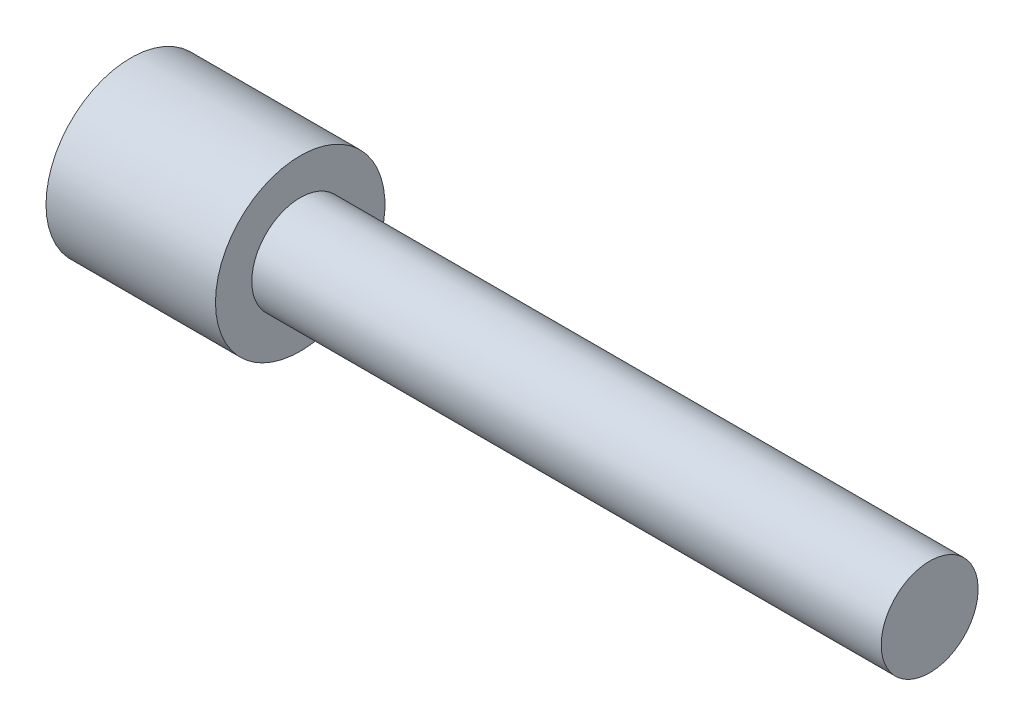
ISO-10303-21;
HEADER;
FILE_DESCRIPTION(('STEP AP214'),'2;1');
FILE_NAME('part.step','',(''),(''),'','','');
FILE_SCHEMA(('AUTOMOTIVE_DESIGN { 1 0 10303 214 1 1 1 1 }'));
ENDSEC;
DATA;
#1=APPLICATION_CONTEXT('core data for automotive mechanical design processes');
#2=APPLICATION_PROTOCOL_DEFINITION('international standard','automotive_design',2000,#1);
#3=PRODUCT_CONTEXT('',#1,'mechanical');
#4=PRODUCT('Part','Part','',(#3));
#5=PRODUCT_RELATED_PRODUCT_CATEGORY('part','',(#4));
#6=PRODUCT_DEFINITION_FORMATION('','',#4);
#7=PRODUCT_DEFINITION_CONTEXT('part definition',#1,'design');
#8=PRODUCT_DEFINITION('design','',#6,#7);
#9=PRODUCT_DEFINITION_SHAPE('','',#8);
#10=(LENGTH_UNIT() NAMED_UNIT(*) SI_UNIT(.MILLI.,.METRE.));
#11=(NAMED_UNIT(*) PLANE_ANGLE_UNIT() SI_UNIT($,.RADIAN.));
#12=(NAMED_UNIT(*) SI_UNIT($,.STERADIAN.) SOLID_ANGLE_UNIT());
#13=UNCERTAINTY_MEASURE_WITH_UNIT(LENGTH_MEASURE(1.E-05),#10,'distance_accuracy_value','');
#14=(GEOMETRIC_REPRESENTATION_CONTEXT(3) GLOBAL_UNCERTAINTY_ASSIGNED_CONTEXT((#13)) GLOBAL_UNIT_ASSIGNED_CONTEXT((#10,
#11,#12)) REPRESENTATION_CONTEXT('',''));
#15=CARTESIAN_POINT('',(0.,0.,0.));
#16=DIRECTION('',(0.,0.,1.));
#17=DIRECTION('',(1.,0.,0.));
#18=AXIS2_PLACEMENT_3D('',#15,#16,#17);
#19=CARTESIAN_POINT('',(-3.30120481927711,1.75,0.));
#20=DIRECTION('',(1.,0.,0.));
#21=DIRECTION('',(0.,0.,-1.));
#22=AXIS2_PLACEMENT_3D('',#19,#20,#21);
#23=PLANE('',#22);
#24=CARTESIAN_POINT('',(-3.30120481927711,0.,0.));
#25=DIRECTION('',(-1.,0.,0.));
#26=DIRECTION('',(0.,0.,1.));
#27=AXIS2_PLACEMENT_3D('',#24,#25,#26);
#28=CIRCLE('',#27,1.75);
#29=CARTESIAN_POINT('',(-3.30120481927711,0.,1.75));
#30=VERTEX_POINT('',#29);
#31=EDGE_CURVE('E47',#30,#30,#28,.T.);
#32=ORIENTED_EDGE('',*,*,#31,.T.);
#33=EDGE_LOOP('',(#32));
#34=FACE_BOUND('',#33,.T.);
#35=ADVANCED_FACE('F33',(#34),#23,.F.);
#36=CARTESIAN_POINT('',(13.1987951807229,0.,0.));
#37=DIRECTION('',(-1.,0.,0.));
#38=DIRECTION('',(0.,0.,1.));
#39=AXIS2_PLACEMENT_3D('',#36,#37,#38);
#40=PLANE('',#39);
#41=CARTESIAN_POINT('',(13.1987951807229,0.,0.));
#42=DIRECTION('',(-1.,0.,0.));
#43=DIRECTION('',(0.,0.,1.));
#44=AXIS2_PLACEMENT_3D('',#41,#42,#43);
#45=CIRCLE('',#44,1.);
#46=CARTESIAN_POINT('',(13.1987951807229,0.,1.));
#47=VERTEX_POINT('',#46);
#48=EDGE_CURVE('E10',#47,#47,#45,.T.);
#49=ORIENTED_EDGE('',*,*,#48,.F.);
#50=EDGE_LOOP('',(#49));
#51=FACE_BOUND('',#50,.T.);
#52=ADVANCED_FACE('F67',(#51),#40,.F.);
#53=CARTESIAN_POINT('',(-3.30120481927711,0.,0.));
#54=DIRECTION('',(-1.,0.,0.));
#55=DIRECTION('',(0.,0.,1.));
#56=AXIS2_PLACEMENT_3D('',#53,#54,#55);
#57=CYLINDRICAL_SURFACE('',#56,0.999999999999999);
#58=CARTESIAN_POINT('',(0.198795180722893,0.,0.));
#59=DIRECTION('',(-1.,0.,0.));
#60=DIRECTION('',(0.,0.,1.));
#61=AXIS2_PLACEMENT_3D('',#58,#59,#60);
#62=CIRCLE('',#61,0.999999999999999);
#63=CARTESIAN_POINT('',(0.198795180722893,0.,0.999999999999999));
#64=VERTEX_POINT('',#63);
#65=EDGE_CURVE('E39',#64,#64,#62,.T.);
#66=ORIENTED_EDGE('',*,*,#65,.F.);
#67=EDGE_LOOP('',(#66));
#68=FACE_BOUND('',#67,.T.);
#69=ORIENTED_EDGE('',*,*,#48,.T.);
#70=EDGE_LOOP('',(#69));
#71=FACE_BOUND('',#70,.T.);
#72=ADVANCED_FACE('F62',(#68,#71),#57,.T.);
#73=CARTESIAN_POINT('',(0.198795180722893,0.999999999999999,0.));
#74=DIRECTION('',(-1.,0.,0.));
#75=DIRECTION('',(0.,0.,1.));
#76=AXIS2_PLACEMENT_3D('',#73,#74,#75);
#77=PLANE('',#76);
#78=CARTESIAN_POINT('',(0.198795180722894,0.,0.));
#79=DIRECTION('',(-1.,0.,0.));
#80=DIRECTION('',(0.,0.,1.));
#81=AXIS2_PLACEMENT_3D('',#78,#79,#80);
#82=CIRCLE('',#81,1.75);
#83=CARTESIAN_POINT('',(0.198795180722894,0.,1.75));
#84=VERTEX_POINT('',#83);
#85=EDGE_CURVE('E43',#84,#84,#82,.T.);
#86=ORIENTED_EDGE('',*,*,#85,.F.);
#87=EDGE_LOOP('',(#86));
#88=FACE_BOUND('',#87,.T.);
#89=ORIENTED_EDGE('',*,*,#65,.T.);
#90=EDGE_LOOP('',(#89));
#91=FACE_BOUND('',#90,.T.);
#92=ADVANCED_FACE('F57',(#88,#91),#77,.F.);
#93=CARTESIAN_POINT('',(-3.30120481927711,0.,0.));
#94=DIRECTION('',(-1.,0.,0.));
#95=DIRECTION('',(0.,0.,1.));
#96=AXIS2_PLACEMENT_3D('',#93,#94,#95);
#97=CYLINDRICAL_SURFACE('',#96,1.75);
#98=ORIENTED_EDGE('',*,*,#31,.F.);
#99=EDGE_LOOP('',(#98));
#100=FACE_BOUND('',#99,.T.);
#101=ORIENTED_EDGE('',*,*,#85,.T.);
#102=EDGE_LOOP('',(#101));
#103=FACE_BOUND('',#102,.T.);
#104=ADVANCED_FACE('F54',(#100,#103),#97,.T.);
#105=CLOSED_SHELL('',(#35,#52,#72,#92,#104));
#106=MANIFOLD_SOLID_BREP('B2',#105);
#107=ADVANCED_BREP_SHAPE_REPRESENTATION('',(#18,#106),#14);
#108=SHAPE_DEFINITION_REPRESENTATION(#9,#107);
ENDSEC;
END-ISO-10303-21;
